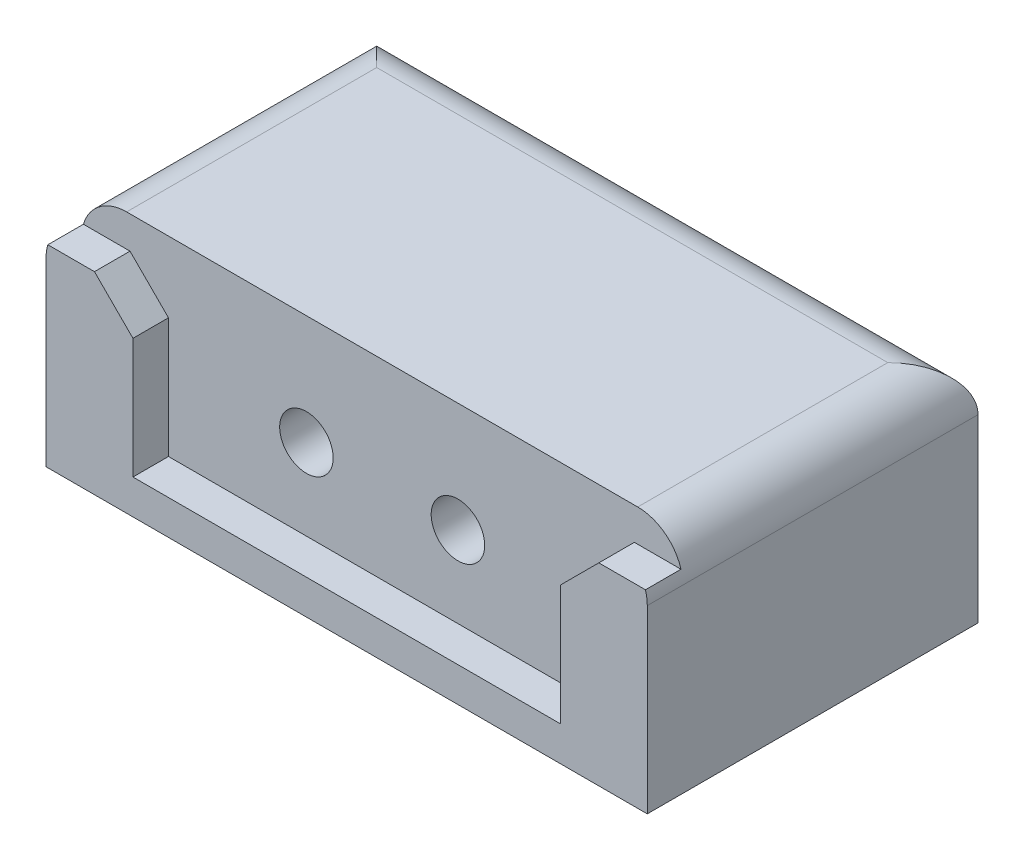
ISO-10303-21;
HEADER;
FILE_DESCRIPTION(('STEP AP214'),'2;1');
FILE_NAME('part.step','',(''),(''),'','','');
FILE_SCHEMA(('AUTOMOTIVE_DESIGN { 1 0 10303 214 1 1 1 1 }'));
ENDSEC;
DATA;
#1=APPLICATION_CONTEXT('core data for automotive mechanical design processes');
#2=APPLICATION_PROTOCOL_DEFINITION('international standard','automotive_design',2000,#1);
#3=PRODUCT_CONTEXT('',#1,'mechanical');
#4=PRODUCT('Part','Part','',(#3));
#5=PRODUCT_RELATED_PRODUCT_CATEGORY('part','',(#4));
#6=PRODUCT_DEFINITION_FORMATION('','',#4);
#7=PRODUCT_DEFINITION_CONTEXT('part definition',#1,'design');
#8=PRODUCT_DEFINITION('design','',#6,#7);
#9=PRODUCT_DEFINITION_SHAPE('','',#8);
#10=(LENGTH_UNIT() NAMED_UNIT(*) SI_UNIT(.MILLI.,.METRE.));
#11=(NAMED_UNIT(*) PLANE_ANGLE_UNIT() SI_UNIT($,.RADIAN.));
#12=(NAMED_UNIT(*) SI_UNIT($,.STERADIAN.) SOLID_ANGLE_UNIT());
#13=UNCERTAINTY_MEASURE_WITH_UNIT(LENGTH_MEASURE(1.E-05),#10,'distance_accuracy_value','');
#14=(GEOMETRIC_REPRESENTATION_CONTEXT(3) GLOBAL_UNCERTAINTY_ASSIGNED_CONTEXT((#13)) GLOBAL_UNIT_ASSIGNED_CONTEXT((#10,
#11,#12)) REPRESENTATION_CONTEXT('',''));
#15=CARTESIAN_POINT('',(0.,0.,0.));
#16=DIRECTION('',(0.,0.,1.));
#17=DIRECTION('',(1.,0.,0.));
#18=AXIS2_PLACEMENT_3D('',#15,#16,#17);
#19=CARTESIAN_POINT('',(12.7,4.7625,13.97));
#20=DIRECTION('',(-1.,0.,0.));
#21=DIRECTION('',(0.,0.,1.));
#22=AXIS2_PLACEMENT_3D('',#19,#20,#21);
#23=PLANE('',#22);
#24=DIRECTION('',(0.,1.,0.));
#25=VECTOR('',#24,1.);
#26=CARTESIAN_POINT('',(12.7,4.7625,0.));
#27=LINE('',#26,#25);
#28=CARTESIAN_POINT('',(12.7,-4.7625,0.));
#29=VERTEX_POINT('',#28);
#30=CARTESIAN_POINT('',(12.7,2.8575,0.));
#31=VERTEX_POINT('',#30);
#32=EDGE_CURVE('E204',#29,#31,#27,.T.);
#33=ORIENTED_EDGE('',*,*,#32,.T.);
#34=DIRECTION('',(0.,0.,-1.));
#35=VECTOR('',#34,1.);
#36=CARTESIAN_POINT('',(12.7,2.8575,13.97));
#37=LINE('',#36,#35);
#38=CARTESIAN_POINT('',(12.7,2.8575,13.97));
#39=VERTEX_POINT('',#38);
#40=EDGE_CURVE('E48',#31,#39,#37,.F.);
#41=ORIENTED_EDGE('',*,*,#40,.T.);
#42=DIRECTION('',(0.,1.,0.));
#43=VECTOR('',#42,1.);
#44=CARTESIAN_POINT('',(12.7,4.7625,13.97));
#45=LINE('',#44,#43);
#46=CARTESIAN_POINT('',(12.7,-4.7625,13.97));
#47=VERTEX_POINT('',#46);
#48=EDGE_CURVE('E212',#47,#39,#45,.T.);
#49=ORIENTED_EDGE('',*,*,#48,.F.);
#50=DIRECTION('',(0.,0.,-1.));
#51=VECTOR('',#50,1.);
#52=CARTESIAN_POINT('',(12.7,-4.7625,13.97));
#53=LINE('',#52,#51);
#54=EDGE_CURVE('E219',#47,#29,#53,.T.);
#55=ORIENTED_EDGE('',*,*,#54,.T.);
#56=EDGE_LOOP('',(#33,#41,#49,#55));
#57=FACE_BOUND('',#56,.T.);
#58=ADVANCED_FACE('F39',(#57),#23,.F.);
#59=CARTESIAN_POINT('',(-12.7,4.7625,13.97));
#60=DIRECTION('',(0.,-1.,0.));
#61=DIRECTION('',(0.,0.,-1.));
#62=AXIS2_PLACEMENT_3D('',#59,#60,#61);
#63=PLANE('',#62);
#64=DIRECTION('',(-1.,0.,0.));
#65=VECTOR('',#64,1.);
#66=CARTESIAN_POINT('',(-12.7,4.7625,1.905));
#67=LINE('',#66,#65);
#68=CARTESIAN_POINT('',(10.795,4.7625,1.905));
#69=VERTEX_POINT('',#68);
#70=CARTESIAN_POINT('',(-10.795,4.7625,1.905));
#71=VERTEX_POINT('',#70);
#72=EDGE_CURVE('E234',#69,#71,#67,.T.);
#73=ORIENTED_EDGE('',*,*,#72,.T.);
#74=DIRECTION('',(0.,0.,-1.));
#75=VECTOR('',#74,1.);
#76=CARTESIAN_POINT('',(-10.795,4.7625,13.97));
#77=LINE('',#76,#75);
#78=CARTESIAN_POINT('',(-10.795,4.7625,12.46886));
#79=VERTEX_POINT('',#78);
#80=EDGE_CURVE('E236',#71,#79,#77,.F.);
#81=ORIENTED_EDGE('',*,*,#80,.T.);
#82=DIRECTION('',(-1.,0.,0.));
#83=VECTOR('',#82,1.);
#84=CARTESIAN_POINT('',(0.,4.7625,12.46886));
#85=LINE('',#84,#83);
#86=CARTESIAN_POINT('',(10.795,4.7625,12.46886));
#87=VERTEX_POINT('',#86);
#88=EDGE_CURVE('E170',#87,#79,#85,.T.);
#89=ORIENTED_EDGE('',*,*,#88,.F.);
#90=DIRECTION('',(0.,0.,-1.));
#91=VECTOR('',#90,1.);
#92=CARTESIAN_POINT('',(10.795,4.7625,13.97));
#93=LINE('',#92,#91);
#94=EDGE_CURVE('E232',#87,#69,#93,.T.);
#95=ORIENTED_EDGE('',*,*,#94,.T.);
#96=EDGE_LOOP('',(#73,#81,#89,#95));
#97=FACE_BOUND('',#96,.T.);
#98=ADVANCED_FACE('F298',(#97),#63,.F.);
#99=CARTESIAN_POINT('',(-12.7,4.7625,13.97));
#100=DIRECTION('',(1.,0.,0.));
#101=DIRECTION('',(0.,0.,-1.));
#102=AXIS2_PLACEMENT_3D('',#99,#100,#101);
#103=PLANE('',#102);
#104=DIRECTION('',(0.,-1.,0.));
#105=VECTOR('',#104,1.);
#106=CARTESIAN_POINT('',(-12.7,4.7625,13.97));
#107=LINE('',#106,#105);
#108=CARTESIAN_POINT('',(-12.7,2.8575,13.97));
#109=VERTEX_POINT('',#108);
#110=CARTESIAN_POINT('',(-12.7,-4.7625,13.97));
#111=VERTEX_POINT('',#110);
#112=EDGE_CURVE('E214',#109,#111,#107,.T.);
#113=ORIENTED_EDGE('',*,*,#112,.F.);
#114=DIRECTION('',(0.,0.,-1.));
#115=VECTOR('',#114,1.);
#116=CARTESIAN_POINT('',(-12.7,2.8575,13.97));
#117=LINE('',#116,#115);
#118=CARTESIAN_POINT('',(-12.7,2.8575,0.));
#119=VERTEX_POINT('',#118);
#120=EDGE_CURVE('E229',#109,#119,#117,.T.);
#121=ORIENTED_EDGE('',*,*,#120,.T.);
#122=DIRECTION('',(0.,-1.,0.));
#123=VECTOR('',#122,1.);
#124=CARTESIAN_POINT('',(-12.7,4.7625,0.));
#125=LINE('',#124,#123);
#126=CARTESIAN_POINT('',(-12.7,-4.7625,0.));
#127=VERTEX_POINT('',#126);
#128=EDGE_CURVE('E221',#119,#127,#125,.T.);
#129=ORIENTED_EDGE('',*,*,#128,.T.);
#130=DIRECTION('',(0.,0.,-1.));
#131=VECTOR('',#130,1.);
#132=CARTESIAN_POINT('',(-12.7,-4.7625,13.97));
#133=LINE('',#132,#131);
#134=EDGE_CURVE('E226',#111,#127,#133,.T.);
#135=ORIENTED_EDGE('',*,*,#134,.F.);
#136=EDGE_LOOP('',(#113,#121,#129,#135));
#137=FACE_BOUND('',#136,.T.);
#138=ADVANCED_FACE('F304',(#137),#103,.F.);
#139=CARTESIAN_POINT('',(0.,0.,13.97));
#140=DIRECTION('',(0.,0.,1.));
#141=DIRECTION('',(1.,0.,0.));
#142=AXIS2_PLACEMENT_3D('',#139,#140,#141);
#143=PLANE('',#142);
#144=DIRECTION('',(-1.,0.,0.));
#145=VECTOR('',#144,1.);
#146=CARTESIAN_POINT('',(0.,3.39800000000001,13.97));
#147=LINE('',#146,#145);
#148=CARTESIAN_POINT('',(-10.6526051224214,3.39800000000001,13.97));
#149=VERTEX_POINT('',#148);
#150=CARTESIAN_POINT('',(-12.6217141949413,3.39800000000001,13.97));
#151=VERTEX_POINT('',#150);
#152=EDGE_CURVE('E162',#149,#151,#147,.T.);
#153=ORIENTED_EDGE('',*,*,#152,.T.);
#154=CARTESIAN_POINT('',(-10.795,2.8575,13.97));
#155=DIRECTION('',(0.,0.,1.));
#156=DIRECTION('',(1.,0.,0.));
#157=AXIS2_PLACEMENT_3D('',#154,#155,#156);
#158=CIRCLE('',#157,1.905);
#159=EDGE_CURVE('E244',#151,#109,#158,.T.);
#160=ORIENTED_EDGE('',*,*,#159,.T.);
#161=ORIENTED_EDGE('',*,*,#112,.T.);
#162=DIRECTION('',(1.,0.,0.));
#163=VECTOR('',#162,1.);
#164=CARTESIAN_POINT('',(-12.7,-4.7625,13.97));
#165=LINE('',#164,#163);
#166=EDGE_CURVE('E217',#111,#47,#165,.T.);
#167=ORIENTED_EDGE('',*,*,#166,.T.);
#168=ORIENTED_EDGE('',*,*,#48,.T.);
#169=CARTESIAN_POINT('',(10.795,2.8575,13.97));
#170=DIRECTION('',(0.,0.,1.));
#171=DIRECTION('',(1.,0.,0.));
#172=AXIS2_PLACEMENT_3D('',#169,#170,#171);
#173=CIRCLE('',#172,1.905);
#174=CARTESIAN_POINT('',(12.6217141949413,3.39799999999999,13.97));
#175=VERTEX_POINT('',#174);
#176=EDGE_CURVE('E64',#39,#175,#173,.T.);
#177=ORIENTED_EDGE('',*,*,#176,.T.);
#178=DIRECTION('',(-1.,0.,0.));
#179=VECTOR('',#178,1.);
#180=CARTESIAN_POINT('',(0.,3.39799999999999,13.97));
#181=LINE('',#180,#179);
#182=CARTESIAN_POINT('',(10.6526051224214,3.39799999999999,13.97));
#183=VERTEX_POINT('',#182);
#184=EDGE_CURVE('E172',#175,#183,#181,.T.);
#185=ORIENTED_EDGE('',*,*,#184,.T.);
#186=DIRECTION('',(-0.707106781186548,-0.707106781186548,0.));
#187=VECTOR('',#186,1.);
#188=CARTESIAN_POINT('',(3.6273025612107,-3.6273025612107,13.97));
#189=LINE('',#188,#187);
#190=CARTESIAN_POINT('',(9.02700000000001,1.77239487757861,13.97));
#191=VERTEX_POINT('',#190);
#192=EDGE_CURVE('E197',#183,#191,#189,.T.);
#193=ORIENTED_EDGE('',*,*,#192,.T.);
#194=DIRECTION('',(0.,-1.,0.));
#195=VECTOR('',#194,1.);
#196=CARTESIAN_POINT('',(9.02700000000001,0.,13.97));
#197=LINE('',#196,#195);
#198=CARTESIAN_POINT('',(9.02700000000001,-3.302,13.97));
#199=VERTEX_POINT('',#198);
#200=EDGE_CURVE('E194',#191,#199,#197,.T.);
#201=ORIENTED_EDGE('',*,*,#200,.T.);
#202=DIRECTION('',(-1.,0.,0.));
#203=VECTOR('',#202,1.);
#204=CARTESIAN_POINT('',(0.,-3.302,13.97));
#205=LINE('',#204,#203);
#206=CARTESIAN_POINT('',(-9.02699999999999,-3.302,13.97));
#207=VERTEX_POINT('',#206);
#208=EDGE_CURVE('E191',#199,#207,#205,.T.);
#209=ORIENTED_EDGE('',*,*,#208,.T.);
#210=DIRECTION('',(0.,1.,0.));
#211=VECTOR('',#210,1.);
#212=CARTESIAN_POINT('',(-9.02699999999999,0.,13.97));
#213=LINE('',#212,#211);
#214=CARTESIAN_POINT('',(-9.02699999999999,1.77239487757863,13.97));
#215=VERTEX_POINT('',#214);
#216=EDGE_CURVE('E188',#207,#215,#213,.T.);
#217=ORIENTED_EDGE('',*,*,#216,.T.);
#218=DIRECTION('',(-0.707106781186548,0.707106781186547,0.));
#219=VECTOR('',#218,1.);
#220=CARTESIAN_POINT('',(-3.62730256121068,-3.62730256121068,13.97));
#221=LINE('',#220,#219);
#222=EDGE_CURVE('E185',#215,#149,#221,.T.);
#223=ORIENTED_EDGE('',*,*,#222,.T.);
#224=EDGE_LOOP('',(#153,#160,#161,#167,#168,#177,#185,#193,#201,#209,#217,#223));
#225=FACE_BOUND('',#224,.T.);
#226=ADVANCED_FACE('F345',(#225),#143,.T.);
#227=CARTESIAN_POINT('',(-12.7,-4.7625,13.97));
#228=DIRECTION('',(0.,1.,0.));
#229=DIRECTION('',(0.,0.,1.));
#230=AXIS2_PLACEMENT_3D('',#227,#228,#229);
#231=PLANE('',#230);
#232=CARTESIAN_POINT('',(-6.985,-4.7625,6.985));
#233=DIRECTION('',(0.,-1.,0.));
#234=DIRECTION('',(0.,0.,-1.));
#235=AXIS2_PLACEMENT_3D('',#232,#233,#234);
#236=CIRCLE('',#235,2.6543);
#237=CARTESIAN_POINT('',(-6.985,-4.7625,4.3307));
#238=VERTEX_POINT('',#237);
#239=EDGE_CURVE('E263',#238,#238,#236,.T.);
#240=ORIENTED_EDGE('',*,*,#239,.F.);
#241=EDGE_LOOP('',(#240));
#242=FACE_BOUND('',#241,.T.);
#243=CARTESIAN_POINT('',(6.985,-4.7625,6.985));
#244=DIRECTION('',(0.,-1.,0.));
#245=DIRECTION('',(0.,0.,-1.));
#246=AXIS2_PLACEMENT_3D('',#243,#244,#245);
#247=CIRCLE('',#246,2.6543);
#248=CARTESIAN_POINT('',(6.985,-4.7625,4.3307));
#249=VERTEX_POINT('',#248);
#250=EDGE_CURVE('E258',#249,#249,#247,.T.);
#251=ORIENTED_EDGE('',*,*,#250,.F.);
#252=EDGE_LOOP('',(#251));
#253=FACE_BOUND('',#252,.T.);
#254=DIRECTION('',(1.,0.,0.));
#255=VECTOR('',#254,1.);
#256=CARTESIAN_POINT('',(-12.7,-4.7625,0.));
#257=LINE('',#256,#255);
#258=EDGE_CURVE('E215',#127,#29,#257,.T.);
#259=ORIENTED_EDGE('',*,*,#258,.T.);
#260=ORIENTED_EDGE('',*,*,#54,.F.);
#261=ORIENTED_EDGE('',*,*,#166,.F.);
#262=ORIENTED_EDGE('',*,*,#134,.T.);
#263=EDGE_LOOP('',(#259,#260,#261,#262));
#264=FACE_BOUND('',#263,.T.);
#265=ADVANCED_FACE('F348',(#242,#253,#264),#231,.F.);
#266=CARTESIAN_POINT('',(0.,0.,0.));
#267=DIRECTION('',(0.,0.,1.));
#268=DIRECTION('',(1.,0.,0.));
#269=AXIS2_PLACEMENT_3D('',#266,#267,#268);
#270=PLANE('',#269);
#271=CARTESIAN_POINT('',(-3.19999999999999,0.125000000000007,0.));
#272=DIRECTION('',(0.,0.,1.));
#273=DIRECTION('',(1.,0.,0.));
#274=AXIS2_PLACEMENT_3D('',#271,#272,#273);
#275=CIRCLE('',#274,1.1303);
#276=CARTESIAN_POINT('',(-2.06969999999999,0.125000000000007,0.));
#277=VERTEX_POINT('',#276);
#278=EDGE_CURVE('E270',#277,#277,#275,.T.);
#279=ORIENTED_EDGE('',*,*,#278,.T.);
#280=EDGE_LOOP('',(#279));
#281=FACE_BOUND('',#280,.T.);
#282=CARTESIAN_POINT('',(3.20000000000001,0.125000000000004,0.));
#283=DIRECTION('',(0.,0.,1.));
#284=DIRECTION('',(1.,0.,0.));
#285=AXIS2_PLACEMENT_3D('',#282,#283,#284);
#286=CIRCLE('',#285,1.1303);
#287=CARTESIAN_POINT('',(4.33030000000001,0.125000000000004,0.));
#288=VERTEX_POINT('',#287);
#289=EDGE_CURVE('E186',#288,#288,#286,.T.);
#290=ORIENTED_EDGE('',*,*,#289,.T.);
#291=EDGE_LOOP('',(#290));
#292=FACE_BOUND('',#291,.T.);
#293=ORIENTED_EDGE('',*,*,#128,.F.);
#294=DIRECTION('',(-1.,0.,0.));
#295=VECTOR('',#294,1.);
#296=CARTESIAN_POINT('',(0.,2.8575,0.));
#297=LINE('',#296,#295);
#298=EDGE_CURVE('E56',#119,#31,#297,.F.);
#299=ORIENTED_EDGE('',*,*,#298,.T.);
#300=ORIENTED_EDGE('',*,*,#32,.F.);
#301=ORIENTED_EDGE('',*,*,#258,.F.);
#302=EDGE_LOOP('',(#293,#299,#300,#301));
#303=FACE_BOUND('',#302,.T.);
#304=ADVANCED_FACE('F279',(#281,#292,#303),#270,.F.);
#305=CARTESIAN_POINT('',(0.,3.39799999999999,12.46886));
#306=DIRECTION('',(0.,1.,0.));
#307=DIRECTION('',(0.,0.,1.));
#308=AXIS2_PLACEMENT_3D('',#305,#306,#307);
#309=PLANE('',#308);
#310=ORIENTED_EDGE('',*,*,#184,.F.);
#311=DIRECTION('',(0.,0.,-1.));
#312=VECTOR('',#311,1.);
#313=CARTESIAN_POINT('',(12.6217141949413,3.39799999999999,13.97));
#314=LINE('',#313,#312);
#315=CARTESIAN_POINT('',(12.6217141949413,3.39799999999999,12.46886));
#316=VERTEX_POINT('',#315);
#317=EDGE_CURVE('E11',#175,#316,#314,.T.);
#318=ORIENTED_EDGE('',*,*,#317,.T.);
#319=DIRECTION('',(-1.,0.,0.));
#320=VECTOR('',#319,1.);
#321=CARTESIAN_POINT('',(0.,3.39799999999999,12.46886));
#322=LINE('',#321,#320);
#323=CARTESIAN_POINT('',(10.6526051224214,3.39799999999999,12.46886));
#324=VERTEX_POINT('',#323);
#325=EDGE_CURVE('E164',#316,#324,#322,.T.);
#326=ORIENTED_EDGE('',*,*,#325,.T.);
#327=DIRECTION('',(0.,0.,1.));
#328=VECTOR('',#327,1.);
#329=CARTESIAN_POINT('',(10.6526051224214,3.39799999999999,12.46886));
#330=LINE('',#329,#328);
#331=EDGE_CURVE('E201',#324,#183,#330,.T.);
#332=ORIENTED_EDGE('',*,*,#331,.T.);
#333=EDGE_LOOP('',(#310,#318,#326,#332));
#334=FACE_BOUND('',#333,.T.);
#335=ADVANCED_FACE('F330',(#334),#309,.T.);
#336=CARTESIAN_POINT('',(3.6273025612107,-3.6273025612107,12.46886));
#337=DIRECTION('',(-0.707106781186548,0.707106781186548,0.));
#338=DIRECTION('',(-0.707106781186548,-0.707106781186548,0.));
#339=AXIS2_PLACEMENT_3D('',#336,#337,#338);
#340=PLANE('',#339);
#341=ORIENTED_EDGE('',*,*,#192,.F.);
#342=ORIENTED_EDGE('',*,*,#331,.F.);
#343=DIRECTION('',(-0.707106781186548,-0.707106781186548,0.));
#344=VECTOR('',#343,1.);
#345=CARTESIAN_POINT('',(3.6273025612107,-3.6273025612107,12.46886));
#346=LINE('',#345,#344);
#347=CARTESIAN_POINT('',(9.02700000000001,1.77239487757861,12.46886));
#348=VERTEX_POINT('',#347);
#349=EDGE_CURVE('E181',#324,#348,#346,.T.);
#350=ORIENTED_EDGE('',*,*,#349,.T.);
#351=DIRECTION('',(0.,0.,1.));
#352=VECTOR('',#351,1.);
#353=CARTESIAN_POINT('',(9.02700000000001,1.77239487757861,12.46886));
#354=LINE('',#353,#352);
#355=EDGE_CURVE('E205',#348,#191,#354,.T.);
#356=ORIENTED_EDGE('',*,*,#355,.T.);
#357=EDGE_LOOP('',(#341,#342,#350,#356));
#358=FACE_BOUND('',#357,.T.);
#359=ADVANCED_FACE('F339',(#358),#340,.T.);
#360=CARTESIAN_POINT('',(9.02700000000001,0.,12.46886));
#361=DIRECTION('',(-1.,0.,0.));
#362=DIRECTION('',(0.,0.,1.));
#363=AXIS2_PLACEMENT_3D('',#360,#361,#362);
#364=PLANE('',#363);
#365=ORIENTED_EDGE('',*,*,#200,.F.);
#366=ORIENTED_EDGE('',*,*,#355,.F.);
#367=DIRECTION('',(0.,-1.,0.));
#368=VECTOR('',#367,1.);
#369=CARTESIAN_POINT('',(9.02700000000001,0.,12.46886));
#370=LINE('',#369,#368);
#371=CARTESIAN_POINT('',(9.02700000000001,-3.302,12.46886));
#372=VERTEX_POINT('',#371);
#373=EDGE_CURVE('E179',#348,#372,#370,.T.);
#374=ORIENTED_EDGE('',*,*,#373,.T.);
#375=DIRECTION('',(0.,0.,1.));
#376=VECTOR('',#375,1.);
#377=CARTESIAN_POINT('',(9.02700000000001,-3.302,12.46886));
#378=LINE('',#377,#376);
#379=EDGE_CURVE('E207',#372,#199,#378,.T.);
#380=ORIENTED_EDGE('',*,*,#379,.T.);
#381=EDGE_LOOP('',(#365,#366,#374,#380));
#382=FACE_BOUND('',#381,.T.);
#383=ADVANCED_FACE('F342',(#382),#364,.T.);
#384=CARTESIAN_POINT('',(0.,-3.302,12.46886));
#385=DIRECTION('',(0.,1.,0.));
#386=DIRECTION('',(0.,0.,1.));
#387=AXIS2_PLACEMENT_3D('',#384,#385,#386);
#388=PLANE('',#387);
#389=ORIENTED_EDGE('',*,*,#208,.F.);
#390=ORIENTED_EDGE('',*,*,#379,.F.);
#391=DIRECTION('',(-1.,0.,0.));
#392=VECTOR('',#391,1.);
#393=CARTESIAN_POINT('',(0.,-3.302,12.46886));
#394=LINE('',#393,#392);
#395=CARTESIAN_POINT('',(-9.02699999999999,-3.302,12.46886));
#396=VERTEX_POINT('',#395);
#397=EDGE_CURVE('E177',#372,#396,#394,.T.);
#398=ORIENTED_EDGE('',*,*,#397,.T.);
#399=DIRECTION('',(0.,0.,1.));
#400=VECTOR('',#399,1.);
#401=CARTESIAN_POINT('',(-9.02699999999999,-3.302,12.46886));
#402=LINE('',#401,#400);
#403=EDGE_CURVE('E209',#396,#207,#402,.T.);
#404=ORIENTED_EDGE('',*,*,#403,.T.);
#405=EDGE_LOOP('',(#389,#390,#398,#404));
#406=FACE_BOUND('',#405,.T.);
#407=ADVANCED_FACE('F523',(#406),#388,.T.);
#408=CARTESIAN_POINT('',(-9.02699999999999,0.,12.46886));
#409=DIRECTION('',(1.,0.,0.));
#410=DIRECTION('',(0.,0.,-1.));
#411=AXIS2_PLACEMENT_3D('',#408,#409,#410);
#412=PLANE('',#411);
#413=ORIENTED_EDGE('',*,*,#216,.F.);
#414=ORIENTED_EDGE('',*,*,#403,.F.);
#415=DIRECTION('',(0.,1.,0.));
#416=VECTOR('',#415,1.);
#417=CARTESIAN_POINT('',(-9.02699999999999,0.,12.46886));
#418=LINE('',#417,#416);
#419=CARTESIAN_POINT('',(-9.02699999999999,1.77239487757863,12.46886));
#420=VERTEX_POINT('',#419);
#421=EDGE_CURVE('E154',#396,#420,#418,.T.);
#422=ORIENTED_EDGE('',*,*,#421,.T.);
#423=DIRECTION('',(0.,0.,1.));
#424=VECTOR('',#423,1.);
#425=CARTESIAN_POINT('',(-9.02699999999999,1.77239487757863,12.46886));
#426=LINE('',#425,#424);
#427=EDGE_CURVE('E150',#420,#215,#426,.T.);
#428=ORIENTED_EDGE('',*,*,#427,.T.);
#429=EDGE_LOOP('',(#413,#414,#422,#428));
#430=FACE_BOUND('',#429,.T.);
#431=ADVANCED_FACE('F515',(#430),#412,.T.);
#432=CARTESIAN_POINT('',(-3.62730256121068,-3.62730256121068,12.46886));
#433=DIRECTION('',(0.707106781186548,0.707106781186548,0.));
#434=DIRECTION('',(-0.707106781186548,0.707106781186547,0.));
#435=AXIS2_PLACEMENT_3D('',#432,#433,#434);
#436=PLANE('',#435);
#437=ORIENTED_EDGE('',*,*,#222,.F.);
#438=ORIENTED_EDGE('',*,*,#427,.F.);
#439=DIRECTION('',(-0.707106781186548,0.707106781186547,0.));
#440=VECTOR('',#439,1.);
#441=CARTESIAN_POINT('',(-3.62730256121068,-3.62730256121068,12.46886));
#442=LINE('',#441,#440);
#443=CARTESIAN_POINT('',(-10.6526051224214,3.39800000000001,12.46886));
#444=VERTEX_POINT('',#443);
#445=EDGE_CURVE('E144',#420,#444,#442,.T.);
#446=ORIENTED_EDGE('',*,*,#445,.T.);
#447=DIRECTION('',(0.,0.,1.));
#448=VECTOR('',#447,1.);
#449=CARTESIAN_POINT('',(-10.6526051224214,3.39800000000001,12.46886));
#450=LINE('',#449,#448);
#451=EDGE_CURVE('E148',#444,#149,#450,.T.);
#452=ORIENTED_EDGE('',*,*,#451,.T.);
#453=EDGE_LOOP('',(#437,#438,#446,#452));
#454=FACE_BOUND('',#453,.T.);
#455=ADVANCED_FACE('F147',(#454),#436,.T.);
#456=CARTESIAN_POINT('',(0.,3.39800000000001,12.46886));
#457=DIRECTION('',(0.,1.,0.));
#458=DIRECTION('',(0.,0.,1.));
#459=AXIS2_PLACEMENT_3D('',#456,#457,#458);
#460=PLANE('',#459);
#461=DIRECTION('',(-1.,0.,0.));
#462=VECTOR('',#461,1.);
#463=CARTESIAN_POINT('',(0.,3.39800000000001,12.46886));
#464=LINE('',#463,#462);
#465=CARTESIAN_POINT('',(-12.6217141949413,3.39800000000001,12.46886));
#466=VERTEX_POINT('',#465);
#467=EDGE_CURVE('E155',#444,#466,#464,.T.);
#468=ORIENTED_EDGE('',*,*,#467,.T.);
#469=DIRECTION('',(0.,0.,-1.));
#470=VECTOR('',#469,1.);
#471=CARTESIAN_POINT('',(-12.6217141949413,3.39800000000001,12.46886));
#472=LINE('',#471,#470);
#473=EDGE_CURVE('E241',#466,#151,#472,.F.);
#474=ORIENTED_EDGE('',*,*,#473,.T.);
#475=ORIENTED_EDGE('',*,*,#152,.F.);
#476=ORIENTED_EDGE('',*,*,#451,.F.);
#477=EDGE_LOOP('',(#468,#474,#475,#476));
#478=FACE_BOUND('',#477,.T.);
#479=ADVANCED_FACE('F159',(#478),#460,.T.);
#480=CARTESIAN_POINT('',(0.,0.,12.46886));
#481=DIRECTION('',(0.,0.,1.));
#482=DIRECTION('',(1.,0.,0.));
#483=AXIS2_PLACEMENT_3D('',#480,#481,#482);
#484=PLANE('',#483);
#485=CARTESIAN_POINT('',(-3.19999999999999,0.125000000000007,12.46886));
#486=DIRECTION('',(0.,0.,1.));
#487=DIRECTION('',(1.,0.,0.));
#488=AXIS2_PLACEMENT_3D('',#485,#486,#487);
#489=CIRCLE('',#488,1.13029999999999);
#490=CARTESIAN_POINT('',(-2.0697,0.125000000000007,12.46886));
#491=VERTEX_POINT('',#490);
#492=EDGE_CURVE('E267',#491,#491,#489,.T.);
#493=ORIENTED_EDGE('',*,*,#492,.F.);
#494=EDGE_LOOP('',(#493));
#495=FACE_BOUND('',#494,.T.);
#496=CARTESIAN_POINT('',(3.20000000000001,0.125000000000004,12.46886));
#497=DIRECTION('',(0.,0.,1.));
#498=DIRECTION('',(1.,0.,0.));
#499=AXIS2_PLACEMENT_3D('',#496,#497,#498);
#500=CIRCLE('',#499,1.13029999999999);
#501=CARTESIAN_POINT('',(4.3303,0.125000000000004,12.46886));
#502=VERTEX_POINT('',#501);
#503=EDGE_CURVE('E274',#502,#502,#500,.T.);
#504=ORIENTED_EDGE('',*,*,#503,.F.);
#505=EDGE_LOOP('',(#504));
#506=FACE_BOUND('',#505,.T.);
#507=ORIENTED_EDGE('',*,*,#88,.T.);
#508=CARTESIAN_POINT('',(-10.795,2.8575,12.46886));
#509=DIRECTION('',(0.,0.,1.));
#510=DIRECTION('',(1.,0.,0.));
#511=AXIS2_PLACEMENT_3D('',#508,#509,#510);
#512=CIRCLE('',#511,1.905);
#513=EDGE_CURVE('E169',#79,#466,#512,.T.);
#514=ORIENTED_EDGE('',*,*,#513,.T.);
#515=ORIENTED_EDGE('',*,*,#467,.F.);
#516=ORIENTED_EDGE('',*,*,#445,.F.);
#517=ORIENTED_EDGE('',*,*,#421,.F.);
#518=ORIENTED_EDGE('',*,*,#397,.F.);
#519=ORIENTED_EDGE('',*,*,#373,.F.);
#520=ORIENTED_EDGE('',*,*,#349,.F.);
#521=ORIENTED_EDGE('',*,*,#325,.F.);
#522=CARTESIAN_POINT('',(10.795,2.8575,12.46886));
#523=DIRECTION('',(0.,0.,1.));
#524=DIRECTION('',(1.,0.,0.));
#525=AXIS2_PLACEMENT_3D('',#522,#523,#524);
#526=CIRCLE('',#525,1.905);
#527=EDGE_CURVE('E238',#316,#87,#526,.T.);
#528=ORIENTED_EDGE('',*,*,#527,.T.);
#529=EDGE_LOOP('',(#507,#514,#515,#516,#517,#518,#519,#520,#521,#528));
#530=FACE_BOUND('',#529,.T.);
#531=ADVANCED_FACE('F167',(#495,#506,#530),#484,.T.);
#532=CARTESIAN_POINT('',(3.20000000000001,0.125000000000004,12.46886));
#533=DIRECTION('',(0.,0.,1.));
#534=DIRECTION('',(1.,0.,0.));
#535=AXIS2_PLACEMENT_3D('',#532,#533,#534);
#536=CYLINDRICAL_SURFACE('',#535,1.13029999999999);
#537=ORIENTED_EDGE('',*,*,#289,.F.);
#538=EDGE_LOOP('',(#537));
#539=FACE_BOUND('',#538,.T.);
#540=ORIENTED_EDGE('',*,*,#503,.T.);
#541=EDGE_LOOP('',(#540));
#542=FACE_BOUND('',#541,.T.);
#543=ADVANCED_FACE('F281',(#539,#542),#536,.F.);
#544=CARTESIAN_POINT('',(-3.19999999999999,0.125000000000007,12.46886));
#545=DIRECTION('',(0.,0.,1.));
#546=DIRECTION('',(1.,0.,0.));
#547=AXIS2_PLACEMENT_3D('',#544,#545,#546);
#548=CYLINDRICAL_SURFACE('',#547,1.13029999999999);
#549=ORIENTED_EDGE('',*,*,#278,.F.);
#550=EDGE_LOOP('',(#549));
#551=FACE_BOUND('',#550,.T.);
#552=ORIENTED_EDGE('',*,*,#492,.T.);
#553=EDGE_LOOP('',(#552));
#554=FACE_BOUND('',#553,.T.);
#555=ADVANCED_FACE('F284',(#551,#554),#548,.F.);
#556=CARTESIAN_POINT('',(6.985,2.8575,6.985));
#557=DIRECTION('',(0.,-1.,0.));
#558=DIRECTION('',(0.,0.,-1.));
#559=AXIS2_PLACEMENT_3D('',#556,#557,#558);
#560=CYLINDRICAL_SURFACE('',#559,2.6543);
#561=CARTESIAN_POINT('',(6.985,2.8575,6.985));
#562=DIRECTION('',(0.,-1.,0.));
#563=DIRECTION('',(0.,0.,-1.));
#564=AXIS2_PLACEMENT_3D('',#561,#562,#563);
#565=CIRCLE('',#564,2.6543);
#566=CARTESIAN_POINT('',(6.985,2.8575,4.3307));
#567=VERTEX_POINT('',#566);
#568=EDGE_CURVE('E253',#567,#567,#565,.T.);
#569=CARTESIAN_POINT('',(6.985,2.8575,4.3307));
#570=CARTESIAN_POINT('',(6.985,2.778125,4.3307));
#571=CARTESIAN_POINT('',(6.985,2.69875,4.3307));
#572=CARTESIAN_POINT('',(6.985,2.54,4.3307));
#573=CARTESIAN_POINT('',(6.985,2.460625,4.3307));
#574=CARTESIAN_POINT('',(6.985,2.301875,4.3307));
#575=CARTESIAN_POINT('',(6.985,2.2225,4.3307));
#576=CARTESIAN_POINT('',(6.985,2.06375,4.3307));
#577=CARTESIAN_POINT('',(6.985,1.984375,4.3307));
#578=CARTESIAN_POINT('',(6.985,1.825625,4.3307));
#579=CARTESIAN_POINT('',(6.985,1.74625,4.3307));
#580=CARTESIAN_POINT('',(6.985,1.5875,4.3307));
#581=CARTESIAN_POINT('',(6.985,1.508125,4.3307));
#582=CARTESIAN_POINT('',(6.985,1.349375,4.3307));
#583=CARTESIAN_POINT('',(6.985,1.27,4.3307));
#584=CARTESIAN_POINT('',(6.985,1.11125,4.3307));
#585=CARTESIAN_POINT('',(6.985,1.031875,4.3307));
#586=CARTESIAN_POINT('',(6.985,0.873124999999999,4.3307));
#587=CARTESIAN_POINT('',(6.985,0.79375,4.3307));
#588=CARTESIAN_POINT('',(6.985,0.635,4.3307));
#589=CARTESIAN_POINT('',(6.985,0.555625,4.3307));
#590=CARTESIAN_POINT('',(6.985,0.396875,4.3307));
#591=CARTESIAN_POINT('',(6.985,0.3175,4.3307));
#592=CARTESIAN_POINT('',(6.985,0.15875,4.3307));
#593=CARTESIAN_POINT('',(6.985,0.0793749999999999,4.3307));
#594=CARTESIAN_POINT('',(6.985,-0.079375,4.3307));
#595=CARTESIAN_POINT('',(6.985,-0.15875,4.3307));
#596=CARTESIAN_POINT('',(6.985,-0.3175,4.3307));
#597=CARTESIAN_POINT('',(6.985,-0.396875,4.3307));
#598=CARTESIAN_POINT('',(6.985,-0.555625,4.3307));
#599=CARTESIAN_POINT('',(6.985,-0.635,4.3307));
#600=CARTESIAN_POINT('',(6.985,-0.79375,4.3307));
#601=CARTESIAN_POINT('',(6.985,-0.873125,4.3307));
#602=CARTESIAN_POINT('',(6.985,-1.031875,4.3307));
#603=CARTESIAN_POINT('',(6.985,-1.11125,4.3307));
#604=CARTESIAN_POINT('',(6.985,-1.27,4.3307));
#605=CARTESIAN_POINT('',(6.985,-1.349375,4.3307));
#606=CARTESIAN_POINT('',(6.985,-1.508125,4.3307));
#607=CARTESIAN_POINT('',(6.985,-1.5875,4.3307));
#608=CARTESIAN_POINT('',(6.985,-1.74625,4.3307));
#609=CARTESIAN_POINT('',(6.985,-1.825625,4.3307));
#610=CARTESIAN_POINT('',(6.985,-1.984375,4.3307));
#611=CARTESIAN_POINT('',(6.985,-2.06375,4.3307));
#612=CARTESIAN_POINT('',(6.985,-2.2225,4.3307));
#613=CARTESIAN_POINT('',(6.985,-2.301875,4.3307));
#614=CARTESIAN_POINT('',(6.985,-2.460625,4.3307));
#615=CARTESIAN_POINT('',(6.985,-2.54,4.3307));
#616=CARTESIAN_POINT('',(6.985,-2.69875,4.3307));
#617=CARTESIAN_POINT('',(6.985,-2.778125,4.3307));
#618=CARTESIAN_POINT('',(6.985,-2.936875,4.3307));
#619=CARTESIAN_POINT('',(6.985,-3.01625,4.3307));
#620=CARTESIAN_POINT('',(6.985,-3.175,4.3307));
#621=CARTESIAN_POINT('',(6.985,-3.254375,4.3307));
#622=CARTESIAN_POINT('',(6.985,-3.413125,4.3307));
#623=CARTESIAN_POINT('',(6.985,-3.4925,4.3307));
#624=CARTESIAN_POINT('',(6.985,-3.65125,4.3307));
#625=CARTESIAN_POINT('',(6.985,-3.730625,4.3307));
#626=CARTESIAN_POINT('',(6.985,-3.889375,4.3307));
#627=CARTESIAN_POINT('',(6.985,-3.96875,4.3307));
#628=CARTESIAN_POINT('',(6.985,-4.1275,4.3307));
#629=CARTESIAN_POINT('',(6.985,-4.206875,4.3307));
#630=CARTESIAN_POINT('',(6.985,-4.365625,4.3307));
#631=CARTESIAN_POINT('',(6.985,-4.445,4.3307));
#632=CARTESIAN_POINT('',(6.985,-4.60375,4.3307));
#633=CARTESIAN_POINT('',(6.985,-4.683125,4.3307));
#634=CARTESIAN_POINT('',(6.985,-4.7625,4.3307));
#635=B_SPLINE_CURVE_WITH_KNOTS('',3,(#569,#570,#571,#572,#573,#574,#575,#576,#577,#578,#579,
#580,#581,#582,#583,#584,#585,#586,#587,#588,#589,#590,#591,#592,#593,#594,#595,#596,#597,#598,
#599,#600,#601,#602,#603,#604,#605,#606,#607,#608,#609,#610,#611,#612,#613,#614,#615,#616,#617,
#618,#619,#620,#621,#622,#623,#624,#625,#626,#627,#628,#629,#630,#631,#632,#633,#634),
.UNSPECIFIED.,.F.,.F.,(4,2,2,2,2,2,2,2,2,2,2,2,2,2,2,2,2,2,2,2,2,2,2,2,2,2,2,2,2,2,2,2,4),(0.,
0.238125,0.47625,0.714375,0.9525,1.190625,1.42875,1.666875,1.905,2.143125,2.38125,2.619375,
2.8575,3.095625,3.33375,3.571875,3.81,4.048125,4.28625,4.524375,4.7625,5.000625,5.23875,
5.476875,5.715,5.953125,6.19125,6.429375,6.6675,6.905625,7.14375,7.381875,7.62),.UNSPECIFIED.);
#636=EDGE_CURVE('BSEAM368',#567,#249,#635,.T.);
#637=ORIENTED_EDGE('',*,*,#568,.F.);
#638=ORIENTED_EDGE('',*,*,#250,.T.);
#639=ORIENTED_EDGE('',*,*,#636,.T.);
#640=ORIENTED_EDGE('',*,*,#636,.F.);
#641=EDGE_LOOP('',(#637,#639,#638,#640));
#642=FACE_BOUND('',#641,.T.);
#643=ADVANCED_FACE('F368',(#642),#560,.F.);
#644=CARTESIAN_POINT('',(6.985,2.8575,6.985));
#645=DIRECTION('',(0.,-1.,0.));
#646=DIRECTION('',(0.,0.,-1.));
#647=AXIS2_PLACEMENT_3D('',#644,#645,#646);
#648=PLANE('',#647);
#649=ORIENTED_EDGE('',*,*,#568,.T.);
#650=EDGE_LOOP('',(#649));
#651=FACE_BOUND('',#650,.T.);
#652=ADVANCED_FACE('F373',(#651),#648,.T.);
#653=CARTESIAN_POINT('',(-6.985,2.8575,6.985));
#654=DIRECTION('',(0.,-1.,0.));
#655=DIRECTION('',(0.,0.,-1.));
#656=AXIS2_PLACEMENT_3D('',#653,#654,#655);
#657=CYLINDRICAL_SURFACE('',#656,2.6543);
#658=CARTESIAN_POINT('',(-6.985,2.8575,6.985));
#659=DIRECTION('',(0.,-1.,0.));
#660=DIRECTION('',(0.,0.,-1.));
#661=AXIS2_PLACEMENT_3D('',#658,#659,#660);
#662=CIRCLE('',#661,2.6543);
#663=CARTESIAN_POINT('',(-6.985,2.8575,4.3307));
#664=VERTEX_POINT('',#663);
#665=EDGE_CURVE('E271',#664,#664,#662,.T.);
#666=CARTESIAN_POINT('',(-6.985,2.8575,4.3307));
#667=CARTESIAN_POINT('',(-6.985,2.778125,4.3307));
#668=CARTESIAN_POINT('',(-6.985,2.69875,4.3307));
#669=CARTESIAN_POINT('',(-6.985,2.54,4.3307));
#670=CARTESIAN_POINT('',(-6.985,2.460625,4.3307));
#671=CARTESIAN_POINT('',(-6.985,2.301875,4.3307));
#672=CARTESIAN_POINT('',(-6.985,2.2225,4.3307));
#673=CARTESIAN_POINT('',(-6.985,2.06375,4.3307));
#674=CARTESIAN_POINT('',(-6.985,1.984375,4.3307));
#675=CARTESIAN_POINT('',(-6.985,1.825625,4.3307));
#676=CARTESIAN_POINT('',(-6.985,1.74625,4.3307));
#677=CARTESIAN_POINT('',(-6.985,1.5875,4.3307));
#678=CARTESIAN_POINT('',(-6.985,1.508125,4.3307));
#679=CARTESIAN_POINT('',(-6.985,1.349375,4.3307));
#680=CARTESIAN_POINT('',(-6.985,1.27,4.3307));
#681=CARTESIAN_POINT('',(-6.985,1.11125,4.3307));
#682=CARTESIAN_POINT('',(-6.985,1.031875,4.3307));
#683=CARTESIAN_POINT('',(-6.985,0.873124999999999,4.3307));
#684=CARTESIAN_POINT('',(-6.985,0.79375,4.3307));
#685=CARTESIAN_POINT('',(-6.985,0.635,4.3307));
#686=CARTESIAN_POINT('',(-6.985,0.555625,4.3307));
#687=CARTESIAN_POINT('',(-6.985,0.396875,4.3307));
#688=CARTESIAN_POINT('',(-6.985,0.3175,4.3307));
#689=CARTESIAN_POINT('',(-6.985,0.15875,4.3307));
#690=CARTESIAN_POINT('',(-6.985,0.0793749999999999,4.3307));
#691=CARTESIAN_POINT('',(-6.985,-0.079375,4.3307));
#692=CARTESIAN_POINT('',(-6.985,-0.15875,4.3307));
#693=CARTESIAN_POINT('',(-6.985,-0.3175,4.3307));
#694=CARTESIAN_POINT('',(-6.985,-0.396875,4.3307));
#695=CARTESIAN_POINT('',(-6.985,-0.555625,4.3307));
#696=CARTESIAN_POINT('',(-6.985,-0.635,4.3307));
#697=CARTESIAN_POINT('',(-6.985,-0.79375,4.3307));
#698=CARTESIAN_POINT('',(-6.985,-0.873125,4.3307));
#699=CARTESIAN_POINT('',(-6.985,-1.031875,4.3307));
#700=CARTESIAN_POINT('',(-6.985,-1.11125,4.3307));
#701=CARTESIAN_POINT('',(-6.985,-1.27,4.3307));
#702=CARTESIAN_POINT('',(-6.985,-1.349375,4.3307));
#703=CARTESIAN_POINT('',(-6.985,-1.508125,4.3307));
#704=CARTESIAN_POINT('',(-6.985,-1.5875,4.3307));
#705=CARTESIAN_POINT('',(-6.985,-1.74625,4.3307));
#706=CARTESIAN_POINT('',(-6.985,-1.825625,4.3307));
#707=CARTESIAN_POINT('',(-6.985,-1.984375,4.3307));
#708=CARTESIAN_POINT('',(-6.985,-2.06375,4.3307));
#709=CARTESIAN_POINT('',(-6.985,-2.2225,4.3307));
#710=CARTESIAN_POINT('',(-6.985,-2.301875,4.3307));
#711=CARTESIAN_POINT('',(-6.985,-2.460625,4.3307));
#712=CARTESIAN_POINT('',(-6.985,-2.54,4.3307));
#713=CARTESIAN_POINT('',(-6.985,-2.69875,4.3307));
#714=CARTESIAN_POINT('',(-6.985,-2.778125,4.3307));
#715=CARTESIAN_POINT('',(-6.985,-2.936875,4.3307));
#716=CARTESIAN_POINT('',(-6.985,-3.01625,4.3307));
#717=CARTESIAN_POINT('',(-6.985,-3.175,4.3307));
#718=CARTESIAN_POINT('',(-6.985,-3.254375,4.3307));
#719=CARTESIAN_POINT('',(-6.985,-3.413125,4.3307));
#720=CARTESIAN_POINT('',(-6.985,-3.4925,4.3307));
#721=CARTESIAN_POINT('',(-6.985,-3.65125,4.3307));
#722=CARTESIAN_POINT('',(-6.985,-3.730625,4.3307));
#723=CARTESIAN_POINT('',(-6.985,-3.889375,4.3307));
#724=CARTESIAN_POINT('',(-6.985,-3.96875,4.3307));
#725=CARTESIAN_POINT('',(-6.985,-4.1275,4.3307));
#726=CARTESIAN_POINT('',(-6.985,-4.206875,4.3307));
#727=CARTESIAN_POINT('',(-6.985,-4.365625,4.3307));
#728=CARTESIAN_POINT('',(-6.985,-4.445,4.3307));
#729=CARTESIAN_POINT('',(-6.985,-4.60375,4.3307));
#730=CARTESIAN_POINT('',(-6.985,-4.683125,4.3307));
#731=CARTESIAN_POINT('',(-6.985,-4.7625,4.3307));
#732=B_SPLINE_CURVE_WITH_KNOTS('',3,(#666,#667,#668,#669,#670,#671,#672,#673,#674,#675,#676,
#677,#678,#679,#680,#681,#682,#683,#684,#685,#686,#687,#688,#689,#690,#691,#692,#693,#694,#695,
#696,#697,#698,#699,#700,#701,#702,#703,#704,#705,#706,#707,#708,#709,#710,#711,#712,#713,#714,
#715,#716,#717,#718,#719,#720,#721,#722,#723,#724,#725,#726,#727,#728,#729,#730,#731),
.UNSPECIFIED.,.F.,.F.,(4,2,2,2,2,2,2,2,2,2,2,2,2,2,2,2,2,2,2,2,2,2,2,2,2,2,2,2,2,2,2,2,4),(0.,
0.238125,0.47625,0.714375,0.9525,1.190625,1.42875,1.666875,1.905,2.143125,2.38125,2.619375,
2.8575,3.095625,3.33375,3.571875,3.81,4.048125,4.28625,4.524375,4.7625,5.000625,5.23875,
5.476875,5.715,5.953125,6.19125,6.429375,6.6675,6.905625,7.14375,7.381875,7.62),.UNSPECIFIED.);
#733=EDGE_CURVE('BSEAM321',#664,#238,#732,.T.);
#734=ORIENTED_EDGE('',*,*,#665,.F.);
#735=ORIENTED_EDGE('',*,*,#239,.T.);
#736=ORIENTED_EDGE('',*,*,#733,.T.);
#737=ORIENTED_EDGE('',*,*,#733,.F.);
#738=EDGE_LOOP('',(#734,#736,#735,#737));
#739=FACE_BOUND('',#738,.T.);
#740=ADVANCED_FACE('F321',(#739),#657,.F.);
#741=CARTESIAN_POINT('',(-6.985,2.8575,6.985));
#742=DIRECTION('',(0.,-1.,0.));
#743=DIRECTION('',(0.,0.,-1.));
#744=AXIS2_PLACEMENT_3D('',#741,#742,#743);
#745=PLANE('',#744);
#746=ORIENTED_EDGE('',*,*,#665,.T.);
#747=EDGE_LOOP('',(#746));
#748=FACE_BOUND('',#747,.T.);
#749=ADVANCED_FACE('F316',(#748),#745,.T.);
#750=CARTESIAN_POINT('',(10.795,2.8575,13.97));
#751=DIRECTION('',(0.,0.,-1.));
#752=DIRECTION('',(-1.,0.,0.));
#753=AXIS2_PLACEMENT_3D('',#750,#751,#752);
#754=CYLINDRICAL_SURFACE('',#753,1.905);
#755=ORIENTED_EDGE('',*,*,#176,.F.);
#756=ORIENTED_EDGE('',*,*,#40,.F.);
#757=CARTESIAN_POINT('',(10.795,2.8575,1.905));
#758=DIRECTION('',(-0.707106781186547,0.,-0.707106781186547));
#759=DIRECTION('',(0.707106781186547,0.,-0.707106781186547));
#760=AXIS2_PLACEMENT_3D('',#757,#758,#759);
#761=ELLIPSE('',#760,2.69407683632075,1.905);
#762=EDGE_CURVE('E43',#69,#31,#761,.T.);
#763=ORIENTED_EDGE('',*,*,#762,.F.);
#764=ORIENTED_EDGE('',*,*,#94,.F.);
#765=ORIENTED_EDGE('',*,*,#527,.F.);
#766=ORIENTED_EDGE('',*,*,#317,.F.);
#767=EDGE_LOOP('',(#755,#756,#763,#764,#765,#766));
#768=FACE_BOUND('',#767,.T.);
#769=ADVANCED_FACE('F41',(#768),#754,.T.);
#770=CARTESIAN_POINT('',(-12.7,2.8575,1.905));
#771=DIRECTION('',(-1.,0.,0.));
#772=DIRECTION('',(0.,0.,1.));
#773=AXIS2_PLACEMENT_3D('',#770,#771,#772);
#774=CYLINDRICAL_SURFACE('',#773,1.905);
#775=ORIENTED_EDGE('',*,*,#762,.T.);
#776=ORIENTED_EDGE('',*,*,#298,.F.);
#777=CARTESIAN_POINT('',(-10.795,2.8575,1.905));
#778=DIRECTION('',(-0.707106781186547,0.,0.707106781186547));
#779=DIRECTION('',(-0.707106781186547,0.,-0.707106781186547));
#780=AXIS2_PLACEMENT_3D('',#777,#778,#779);
#781=ELLIPSE('',#780,2.69407683632075,1.905);
#782=EDGE_CURVE('E247',#71,#119,#781,.T.);
#783=ORIENTED_EDGE('',*,*,#782,.F.);
#784=ORIENTED_EDGE('',*,*,#72,.F.);
#785=EDGE_LOOP('',(#775,#776,#783,#784));
#786=FACE_BOUND('',#785,.T.);
#787=ADVANCED_FACE('F311',(#786),#774,.T.);
#788=CARTESIAN_POINT('',(-10.795,2.8575,13.97));
#789=DIRECTION('',(0.,0.,-1.));
#790=DIRECTION('',(-1.,0.,0.));
#791=AXIS2_PLACEMENT_3D('',#788,#789,#790);
#792=CYLINDRICAL_SURFACE('',#791,1.905);
#793=ORIENTED_EDGE('',*,*,#513,.F.);
#794=ORIENTED_EDGE('',*,*,#80,.F.);
#795=ORIENTED_EDGE('',*,*,#782,.T.);
#796=ORIENTED_EDGE('',*,*,#120,.F.);
#797=ORIENTED_EDGE('',*,*,#159,.F.);
#798=ORIENTED_EDGE('',*,*,#473,.F.);
#799=EDGE_LOOP('',(#793,#794,#795,#796,#797,#798));
#800=FACE_BOUND('',#799,.T.);
#801=ADVANCED_FACE('F309',(#800),#792,.T.);
#802=CLOSED_SHELL('',(#58,#98,#138,#226,#265,#304,#335,#359,#383,#407,#431,#455,#479,#531,#543,
#555,#643,#652,#740,#749,#769,#787,#801));
#803=MANIFOLD_SOLID_BREP('B2',#802);
#804=ADVANCED_BREP_SHAPE_REPRESENTATION('',(#18,#803),#14);
#805=SHAPE_DEFINITION_REPRESENTATION(#9,#804);
ENDSEC;
END-ISO-10303-21;
